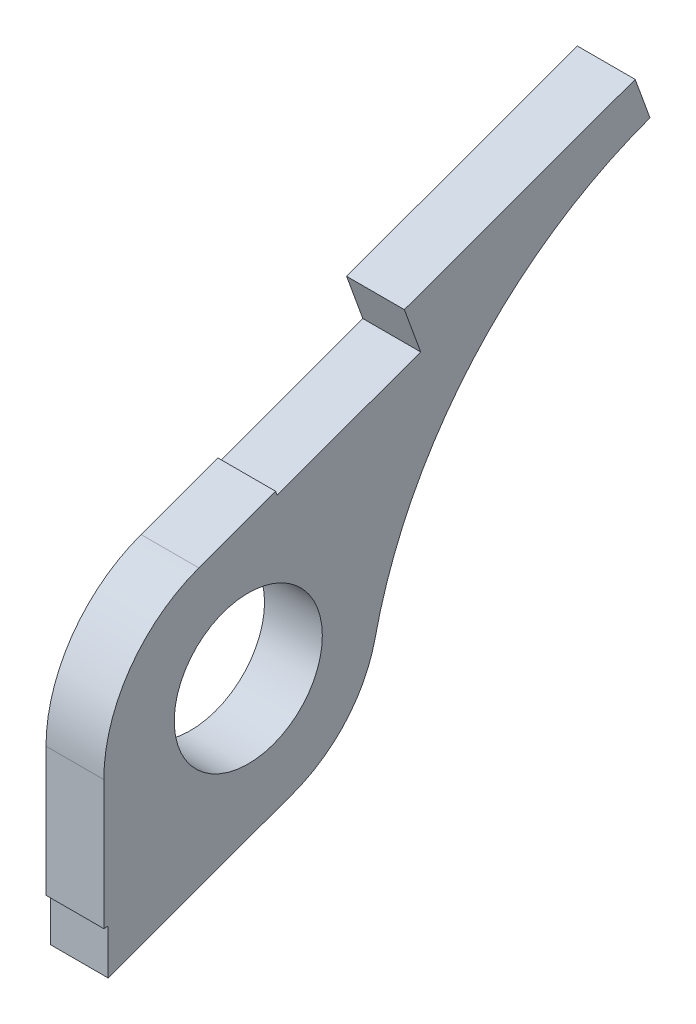
ISO-10303-21;
HEADER;
FILE_DESCRIPTION(('STEP AP214'),'2;1');
FILE_NAME('part.step','',(''),(''),'','','');
FILE_SCHEMA(('AUTOMOTIVE_DESIGN { 1 0 10303 214 1 1 1 1 }'));
ENDSEC;
DATA;
#1=APPLICATION_CONTEXT('core data for automotive mechanical design processes');
#2=APPLICATION_PROTOCOL_DEFINITION('international standard','automotive_design',2000,#1);
#3=PRODUCT_CONTEXT('',#1,'mechanical');
#4=PRODUCT('Part','Part','',(#3));
#5=PRODUCT_RELATED_PRODUCT_CATEGORY('part','',(#4));
#6=PRODUCT_DEFINITION_FORMATION('','',#4);
#7=PRODUCT_DEFINITION_CONTEXT('part definition',#1,'design');
#8=PRODUCT_DEFINITION('design','',#6,#7);
#9=PRODUCT_DEFINITION_SHAPE('','',#8);
#10=(LENGTH_UNIT() NAMED_UNIT(*) SI_UNIT(.MILLI.,.METRE.));
#11=(NAMED_UNIT(*) PLANE_ANGLE_UNIT() SI_UNIT($,.RADIAN.));
#12=(NAMED_UNIT(*) SI_UNIT($,.STERADIAN.) SOLID_ANGLE_UNIT());
#13=UNCERTAINTY_MEASURE_WITH_UNIT(LENGTH_MEASURE(1.E-05),#10,'distance_accuracy_value','');
#14=(GEOMETRIC_REPRESENTATION_CONTEXT(3) GLOBAL_UNCERTAINTY_ASSIGNED_CONTEXT((#13)) GLOBAL_UNIT_ASSIGNED_CONTEXT((#10,
#11,#12)) REPRESENTATION_CONTEXT('',''));
#15=CARTESIAN_POINT('',(0.,0.,0.));
#16=DIRECTION('',(0.,0.,1.));
#17=DIRECTION('',(1.,0.,0.));
#18=AXIS2_PLACEMENT_3D('',#15,#16,#17);
#19=CARTESIAN_POINT('',(241.308851424871,106.448198171886,262.091802222187));
#20=DIRECTION('',(0.,0.342020143325663,-0.93969262078591));
#21=DIRECTION('',(0.,0.939692620785911,0.342020143325663));
#22=AXIS2_PLACEMENT_3D('',#19,#20,#21);
#23=PLANE('',#22);
#24=DIRECTION('',(0.,0.93969262078591,0.342020143325663));
#25=VECTOR('',#24,1.);
#26=CARTESIAN_POINT('',(237.308851424871,106.448198171886,262.091802222187));
#27=LINE('',#26,#25);
#28=CARTESIAN_POINT('',(237.308851424871,106.730105958122,262.194408265185));
#29=VERTEX_POINT('',#28);
#30=CARTESIAN_POINT('',(237.308851424871,109.549183820479,263.220468695162));
#31=VERTEX_POINT('',#30);
#32=EDGE_CURVE('E234',#29,#31,#27,.T.);
#33=ORIENTED_EDGE('',*,*,#32,.T.);
#34=DIRECTION('',(-1.,0.,0.));
#35=VECTOR('',#34,1.);
#36=CARTESIAN_POINT('',(241.308851424871,109.549183820479,263.220468695162));
#37=LINE('',#36,#35);
#38=CARTESIAN_POINT('',(241.308851424871,109.549183820479,263.220468695162));
#39=VERTEX_POINT('',#38);
#40=EDGE_CURVE('E265',#39,#31,#37,.T.);
#41=ORIENTED_EDGE('',*,*,#40,.F.);
#42=DIRECTION('',(0.,0.93969262078591,0.342020143325663));
#43=VECTOR('',#42,1.);
#44=CARTESIAN_POINT('',(241.308851424871,106.448198171886,262.091802222187));
#45=LINE('',#44,#43);
#46=CARTESIAN_POINT('',(241.308851424871,106.730105958122,262.194408265185));
#47=VERTEX_POINT('',#46);
#48=EDGE_CURVE('E235',#47,#39,#45,.T.);
#49=ORIENTED_EDGE('',*,*,#48,.F.);
#50=DIRECTION('',(-1.,0.,0.));
#51=VECTOR('',#50,1.);
#52=CARTESIAN_POINT('',(241.308851424871,106.730105958122,262.194408265185));
#53=LINE('',#52,#51);
#54=EDGE_CURVE('E174',#47,#29,#53,.T.);
#55=ORIENTED_EDGE('',*,*,#54,.T.);
#56=EDGE_LOOP('',(#33,#41,#49,#55));
#57=FACE_BOUND('',#56,.T.);
#58=ADVANCED_FACE('F41',(#57),#23,.T.);
#59=CARTESIAN_POINT('',(241.308851424871,100.63385573535,278.066576775547));
#60=DIRECTION('',(0.,-0.342020143325663,0.93969262078591));
#61=DIRECTION('',(0.,-0.939692620785911,-0.342020143325663));
#62=AXIS2_PLACEMENT_3D('',#59,#60,#61);
#63=PLANE('',#62);
#64=DIRECTION('',(0.,0.93969262078591,0.342020143325663));
#65=VECTOR('',#64,1.);
#66=CARTESIAN_POINT('',(241.308851424871,100.63385573535,278.066576775547));
#67=LINE('',#66,#65);
#68=CARTESIAN_POINT('',(241.308851424871,100.63385573535,278.066576775547));
#69=VERTEX_POINT('',#68);
#70=CARTESIAN_POINT('',(241.308851424871,103.734841383943,279.195243248522));
#71=VERTEX_POINT('',#70);
#72=EDGE_CURVE('E244',#69,#71,#67,.T.);
#73=ORIENTED_EDGE('',*,*,#72,.T.);
#74=DIRECTION('',(1.,0.,0.));
#75=VECTOR('',#74,1.);
#76=CARTESIAN_POINT('',(237.308851424871,103.734841383943,279.195243248522));
#77=LINE('',#76,#75);
#78=CARTESIAN_POINT('',(237.308851424871,103.734841383943,279.195243248522));
#79=VERTEX_POINT('',#78);
#80=EDGE_CURVE('E57',#79,#71,#77,.T.);
#81=ORIENTED_EDGE('',*,*,#80,.F.);
#82=DIRECTION('',(0.,0.93969262078591,0.342020143325663));
#83=VECTOR('',#82,1.);
#84=CARTESIAN_POINT('',(237.308851424871,100.63385573535,278.066576775547));
#85=LINE('',#84,#83);
#86=CARTESIAN_POINT('',(237.308851424871,100.63385573535,278.066576775548));
#87=VERTEX_POINT('',#86);
#88=EDGE_CURVE('E241',#87,#79,#85,.T.);
#89=ORIENTED_EDGE('',*,*,#88,.F.);
#90=DIRECTION('',(1.,0.,0.));
#91=VECTOR('',#90,1.);
#92=CARTESIAN_POINT('',(241.308851424871,100.63385573535,278.066576775547));
#93=LINE('',#92,#91);
#94=EDGE_CURVE('E242',#87,#69,#93,.T.);
#95=ORIENTED_EDGE('',*,*,#94,.T.);
#96=EDGE_LOOP('',(#73,#81,#89,#95));
#97=FACE_BOUND('',#96,.T.);
#98=ADVANCED_FACE('F286',(#97),#63,.T.);
#99=CARTESIAN_POINT('',(237.308851424871,78.5393273345444,251.933803965415));
#100=DIRECTION('',(1.,0.,0.));
#101=DIRECTION('',(0.,0.,-1.));
#102=AXIS2_PLACEMENT_3D('',#99,#100,#101);
#103=PLANE('',#102);
#104=CARTESIAN_POINT('',(237.308851424871,87.0329435138107,289.997677706789));
#105=DIRECTION('',(1.,0.,0.));
#106=DIRECTION('',(0.,0.,-1.));
#107=AXIS2_PLACEMENT_3D('',#104,#105,#106);
#108=CIRCLE('',#107,5.125);
#109=CARTESIAN_POINT('',(237.308851424871,87.0329435138107,284.872677706789));
#110=VERTEX_POINT('',#109);
#111=EDGE_CURVE('E175',#110,#110,#108,.T.);
#112=ORIENTED_EDGE('',*,*,#111,.T.);
#113=EDGE_LOOP('',(#112));
#114=FACE_BOUND('',#113,.T.);
#115=DIRECTION('',(0.,-0.342020143325664,0.93969262078591));
#116=VECTOR('',#115,1.);
#117=CARTESIAN_POINT('',(237.308851424871,109.549183820479,263.220468695162));
#118=LINE('',#117,#116);
#119=EDGE_CURVE('E240',#31,#79,#118,.T.);
#120=ORIENTED_EDGE('',*,*,#119,.F.);
#121=ORIENTED_EDGE('',*,*,#32,.F.);
#122=CARTESIAN_POINT('',(237.308851424871,78.5393273345444,251.933803965415));
#123=DIRECTION('',(-1.,0.,0.));
#124=DIRECTION('',(0.,0.,-1.));
#125=AXIS2_PLACEMENT_3D('',#122,#123,#124);
#126=CIRCLE('',#125,30.0000000000002);
#127=CARTESIAN_POINT('',(237.308851424871,85.0728782416731,281.213706843395));
#128=VERTEX_POINT('',#127);
#129=EDGE_CURVE('E178',#128,#29,#126,.T.);
#130=ORIENTED_EDGE('',*,*,#129,.F.);
#131=CARTESIAN_POINT('',(237.308851424871,87.0329435138107,289.997677706789));
#132=DIRECTION('',(1.,0.,0.));
#133=DIRECTION('',(0.,0.,-1.));
#134=AXIS2_PLACEMENT_3D('',#131,#132,#133);
#135=CIRCLE('',#134,8.99999999999944);
#136=CARTESIAN_POINT('',(237.308851424871,78.5757099267382,286.919496416858));
#137=VERTEX_POINT('',#136);
#138=EDGE_CURVE('E206',#137,#128,#135,.T.);
#139=ORIENTED_EDGE('',*,*,#138,.F.);
#140=DIRECTION('',(0.,0.34202014332588,-0.939692620785831));
#141=VECTOR('',#140,1.);
#142=CARTESIAN_POINT('',(237.308851424871,73.8156412188629,299.997677706789));
#143=LINE('',#142,#141);
#144=CARTESIAN_POINT('',(237.308851424871,73.924832289143,299.697677706789));
#145=VERTEX_POINT('',#144);
#146=EDGE_CURVE('E200',#145,#137,#143,.T.);
#147=ORIENTED_EDGE('',*,*,#146,.F.);
#148=DIRECTION('',(0.,-1.,0.));
#149=VECTOR('',#148,1.);
#150=CARTESIAN_POINT('',(237.308851424871,78.5393273345444,299.697677706789));
#151=LINE('',#150,#149);
#152=CARTESIAN_POINT('',(237.308851424871,77.0329435138107,299.697677706789));
#153=VERTEX_POINT('',#152);
#154=EDGE_CURVE('E183',#153,#145,#151,.T.);
#155=ORIENTED_EDGE('',*,*,#154,.F.);
#156=DIRECTION('',(0.,0.,1.));
#157=VECTOR('',#156,1.);
#158=CARTESIAN_POINT('',(237.308851424871,77.0329435138107,251.933803965415));
#159=LINE('',#158,#157);
#160=CARTESIAN_POINT('',(237.308851424871,77.0329435138107,299.997677706789));
#161=VERTEX_POINT('',#160);
#162=EDGE_CURVE('E179',#153,#161,#159,.T.);
#163=ORIENTED_EDGE('',*,*,#162,.T.);
#164=DIRECTION('',(0.,-1.,0.));
#165=VECTOR('',#164,1.);
#166=CARTESIAN_POINT('',(237.308851424871,85.9687657413357,299.997677706789));
#167=LINE('',#166,#165);
#168=CARTESIAN_POINT('',(237.308851424871,85.9687657413357,299.997677706789));
#169=VERTEX_POINT('',#168);
#170=EDGE_CURVE('E142',#169,#161,#167,.T.);
#171=ORIENTED_EDGE('',*,*,#170,.F.);
#172=CARTESIAN_POINT('',(237.308851424871,85.9687657413348,289.997677706789));
#173=DIRECTION('',(1.,0.,0.));
#174=DIRECTION('',(0.,0.,-1.));
#175=AXIS2_PLACEMENT_3D('',#172,#173,#174);
#176=CIRCLE('',#175,10.0000000000002);
#177=CARTESIAN_POINT('',(237.308851424871,95.3656919491942,293.417879140046));
#178=VERTEX_POINT('',#177);
#179=EDGE_CURVE('E201',#178,#169,#176,.T.);
#180=ORIENTED_EDGE('',*,*,#179,.F.);
#181=DIRECTION('',(0.,-0.342020143325735,0.939692620785884));
#182=VECTOR('',#181,1.);
#183=CARTESIAN_POINT('',(237.308851424871,97.3005430514117,288.101919426697));
#184=LINE('',#183,#182);
#185=CARTESIAN_POINT('',(237.308851424871,97.3005430514117,288.101919426697));
#186=VERTEX_POINT('',#185);
#187=EDGE_CURVE('E210',#186,#178,#184,.T.);
#188=ORIENTED_EDGE('',*,*,#187,.F.);
#189=DIRECTION('',(0.,0.939692620785911,0.342020143325663));
#190=VECTOR('',#189,1.);
#191=CARTESIAN_POINT('',(237.308851424871,69.1097644278345,277.841315126928));
#192=LINE('',#191,#190);
#193=CARTESIAN_POINT('',(237.308851424871,97.0186352651759,287.9993133837));
#194=VERTEX_POINT('',#193);
#195=EDGE_CURVE('E260',#194,#186,#192,.T.);
#196=ORIENTED_EDGE('',*,*,#195,.F.);
#197=DIRECTION('',(0.,-0.342020143325663,0.939692620785911));
#198=VECTOR('',#197,1.);
#199=CARTESIAN_POINT('',(237.308851424871,106.448198171886,262.091802222187));
#200=LINE('',#199,#198);
#201=EDGE_CURVE('E250',#87,#194,#200,.T.);
#202=ORIENTED_EDGE('',*,*,#201,.F.);
#203=ORIENTED_EDGE('',*,*,#88,.T.);
#204=EDGE_LOOP('',(#120,#121,#130,#139,#147,#155,#163,#171,#180,#188,#196,#202,#203));
#205=FACE_BOUND('',#204,.T.);
#206=ADVANCED_FACE('F238',(#114,#205),#103,.F.);
#207=CARTESIAN_POINT('',(241.308851424871,78.5393273345444,251.933803965415));
#208=DIRECTION('',(1.,0.,0.));
#209=DIRECTION('',(0.,0.,-1.));
#210=AXIS2_PLACEMENT_3D('',#207,#208,#209);
#211=PLANE('',#210);
#212=DIRECTION('',(0.,1.,0.));
#213=VECTOR('',#212,1.);
#214=CARTESIAN_POINT('',(241.308851424871,78.5393273345444,299.697677706789));
#215=LINE('',#214,#213);
#216=CARTESIAN_POINT('',(241.308851424871,73.924832289143,299.697677706789));
#217=VERTEX_POINT('',#216);
#218=CARTESIAN_POINT('',(241.308851424871,77.0329435138107,299.697677706789));
#219=VERTEX_POINT('',#218);
#220=EDGE_CURVE('E153',#217,#219,#215,.T.);
#221=ORIENTED_EDGE('',*,*,#220,.F.);
#222=DIRECTION('',(0.,0.34202014332588,-0.939692620785831));
#223=VECTOR('',#222,1.);
#224=CARTESIAN_POINT('',(241.308851424871,73.8156412188629,299.997677706789));
#225=LINE('',#224,#223);
#226=CARTESIAN_POINT('',(241.308851424871,78.5757099267382,286.919496416858));
#227=VERTEX_POINT('',#226);
#228=EDGE_CURVE('E161',#217,#227,#225,.T.);
#229=ORIENTED_EDGE('',*,*,#228,.T.);
#230=CARTESIAN_POINT('',(241.308851424871,87.0329435138107,289.997677706789));
#231=DIRECTION('',(1.,0.,0.));
#232=DIRECTION('',(0.,0.,-1.));
#233=AXIS2_PLACEMENT_3D('',#230,#231,#232);
#234=CIRCLE('',#233,8.99999999999944);
#235=CARTESIAN_POINT('',(241.308851424871,85.0728782416731,281.213706843395));
#236=VERTEX_POINT('',#235);
#237=EDGE_CURVE('E165',#227,#236,#234,.T.);
#238=ORIENTED_EDGE('',*,*,#237,.T.);
#239=CARTESIAN_POINT('',(241.308851424871,78.5393273345444,251.933803965415));
#240=DIRECTION('',(-1.,0.,0.));
#241=DIRECTION('',(0.,0.,-1.));
#242=AXIS2_PLACEMENT_3D('',#239,#240,#241);
#243=CIRCLE('',#242,30.0000000000002);
#244=EDGE_CURVE('E172',#236,#47,#243,.T.);
#245=ORIENTED_EDGE('',*,*,#244,.T.);
#246=ORIENTED_EDGE('',*,*,#48,.T.);
#247=DIRECTION('',(0.,0.342020143325663,-0.93969262078591));
#248=VECTOR('',#247,1.);
#249=CARTESIAN_POINT('',(241.308851424871,103.734841383943,279.195243248522));
#250=LINE('',#249,#248);
#251=EDGE_CURVE('E267',#71,#39,#250,.T.);
#252=ORIENTED_EDGE('',*,*,#251,.F.);
#253=ORIENTED_EDGE('',*,*,#72,.F.);
#254=DIRECTION('',(0.,-0.342020143325663,0.939692620785911));
#255=VECTOR('',#254,1.);
#256=CARTESIAN_POINT('',(241.308851424871,106.448198171886,262.091802222187));
#257=LINE('',#256,#255);
#258=CARTESIAN_POINT('',(241.308851424871,97.0186352651759,287.9993133837));
#259=VERTEX_POINT('',#258);
#260=EDGE_CURVE('E192',#69,#259,#257,.T.);
#261=ORIENTED_EDGE('',*,*,#260,.T.);
#262=DIRECTION('',(0.,0.939692620785911,0.342020143325663));
#263=VECTOR('',#262,1.);
#264=CARTESIAN_POINT('',(241.308851424871,69.1097644278345,277.841315126928));
#265=LINE('',#264,#263);
#266=CARTESIAN_POINT('',(241.308851424871,97.3005430514117,288.101919426697));
#267=VERTEX_POINT('',#266);
#268=EDGE_CURVE('E247',#259,#267,#265,.T.);
#269=ORIENTED_EDGE('',*,*,#268,.T.);
#270=DIRECTION('',(0.,-0.342020143325675,0.939692620785906));
#271=VECTOR('',#270,1.);
#272=CARTESIAN_POINT('',(241.308851424871,106.730105958122,262.194408265185));
#273=LINE('',#272,#271);
#274=CARTESIAN_POINT('',(241.308851424871,95.3656919491942,293.417879140046));
#275=VERTEX_POINT('',#274);
#276=EDGE_CURVE('E167',#267,#275,#273,.T.);
#277=ORIENTED_EDGE('',*,*,#276,.T.);
#278=CARTESIAN_POINT('',(241.308851424871,85.9687657413348,289.997677706789));
#279=DIRECTION('',(1.,0.,0.));
#280=DIRECTION('',(0.,0.,-1.));
#281=AXIS2_PLACEMENT_3D('',#278,#279,#280);
#282=CIRCLE('',#281,10.0000000000002);
#283=CARTESIAN_POINT('',(241.308851424871,85.9687657413357,299.997677706789));
#284=VERTEX_POINT('',#283);
#285=EDGE_CURVE('E158',#275,#284,#282,.T.);
#286=ORIENTED_EDGE('',*,*,#285,.T.);
#287=DIRECTION('',(0.,-1.,0.));
#288=VECTOR('',#287,1.);
#289=CARTESIAN_POINT('',(241.308851424871,85.9687657413357,299.997677706789));
#290=LINE('',#289,#288);
#291=CARTESIAN_POINT('',(241.308851424871,77.0329435138107,299.997677706789));
#292=VERTEX_POINT('',#291);
#293=EDGE_CURVE('E140',#284,#292,#290,.T.);
#294=ORIENTED_EDGE('',*,*,#293,.T.);
#295=DIRECTION('',(0.,0.,1.));
#296=VECTOR('',#295,1.);
#297=CARTESIAN_POINT('',(241.308851424871,77.0329435138107,251.933803965415));
#298=LINE('',#297,#296);
#299=EDGE_CURVE('E147',#219,#292,#298,.T.);
#300=ORIENTED_EDGE('',*,*,#299,.F.);
#301=EDGE_LOOP('',(#221,#229,#238,#245,#246,#252,#253,#261,#269,#277,#286,#294,#300));
#302=FACE_BOUND('',#301,.T.);
#303=CARTESIAN_POINT('',(241.308851424871,87.0329435138107,289.997677706789));
#304=DIRECTION('',(1.,0.,0.));
#305=DIRECTION('',(0.,0.,-1.));
#306=AXIS2_PLACEMENT_3D('',#303,#304,#305);
#307=CIRCLE('',#306,5.125);
#308=CARTESIAN_POINT('',(241.308851424871,87.0329435138107,284.872677706789));
#309=VERTEX_POINT('',#308);
#310=EDGE_CURVE('E180',#309,#309,#307,.T.);
#311=ORIENTED_EDGE('',*,*,#310,.F.);
#312=EDGE_LOOP('',(#311));
#313=FACE_BOUND('',#312,.T.);
#314=ADVANCED_FACE('F155',(#302,#313),#211,.T.);
#315=CARTESIAN_POINT('',(241.308851424871,85.9687657413357,299.997677706789));
#316=DIRECTION('',(0.,0.,-1.));
#317=DIRECTION('',(0.,1.,0.));
#318=AXIS2_PLACEMENT_3D('',#315,#316,#317);
#319=PLANE('',#318);
#320=DIRECTION('',(-1.,0.,0.));
#321=VECTOR('',#320,1.);
#322=CARTESIAN_POINT('',(191.308851424871,77.0329435138107,299.997677706789));
#323=LINE('',#322,#321);
#324=EDGE_CURVE('E45',#292,#161,#323,.T.);
#325=ORIENTED_EDGE('',*,*,#324,.F.);
#326=ORIENTED_EDGE('',*,*,#293,.F.);
#327=DIRECTION('',(-1.,0.,0.));
#328=VECTOR('',#327,1.);
#329=CARTESIAN_POINT('',(241.308851424871,85.9687657413357,299.997677706789));
#330=LINE('',#329,#328);
#331=EDGE_CURVE('E202',#284,#169,#330,.T.);
#332=ORIENTED_EDGE('',*,*,#331,.T.);
#333=ORIENTED_EDGE('',*,*,#170,.T.);
#334=EDGE_LOOP('',(#325,#326,#332,#333));
#335=FACE_BOUND('',#334,.T.);
#336=ADVANCED_FACE('F137',(#335),#319,.F.);
#337=CARTESIAN_POINT('',(239.308851424871,77.0329435138107,299.697677706789));
#338=DIRECTION('',(0.,1.,0.));
#339=DIRECTION('',(0.,0.,1.));
#340=AXIS2_PLACEMENT_3D('',#337,#338,#339);
#341=PLANE('',#340);
#342=DIRECTION('',(-1.,0.,0.));
#343=VECTOR('',#342,1.);
#344=CARTESIAN_POINT('',(239.308851424871,77.0329435138107,299.697677706789));
#345=LINE('',#344,#343);
#346=EDGE_CURVE('E145',#219,#153,#345,.T.);
#347=ORIENTED_EDGE('',*,*,#346,.F.);
#348=ORIENTED_EDGE('',*,*,#299,.T.);
#349=ORIENTED_EDGE('',*,*,#324,.T.);
#350=ORIENTED_EDGE('',*,*,#162,.F.);
#351=EDGE_LOOP('',(#347,#348,#349,#350));
#352=FACE_BOUND('',#351,.T.);
#353=ADVANCED_FACE('F148',(#352),#341,.F.);
#354=CARTESIAN_POINT('',(0.,0.,299.697677706789));
#355=DIRECTION('',(0.,0.,1.));
#356=DIRECTION('',(1.,0.,0.));
#357=AXIS2_PLACEMENT_3D('',#354,#355,#356);
#358=PLANE('',#357);
#359=ORIENTED_EDGE('',*,*,#154,.T.);
#360=DIRECTION('',(1.,0.,0.));
#361=VECTOR('',#360,1.);
#362=CARTESIAN_POINT('',(241.308851424871,73.924832289143,299.697677706789));
#363=LINE('',#362,#361);
#364=EDGE_CURVE('E186',#145,#217,#363,.T.);
#365=ORIENTED_EDGE('',*,*,#364,.T.);
#366=ORIENTED_EDGE('',*,*,#220,.T.);
#367=ORIENTED_EDGE('',*,*,#346,.T.);
#368=EDGE_LOOP('',(#359,#365,#366,#367));
#369=FACE_BOUND('',#368,.T.);
#370=ADVANCED_FACE('F43',(#369),#358,.T.);
#371=CARTESIAN_POINT('',(241.308851424871,73.8156412188629,299.997677706789));
#372=DIRECTION('',(0.,0.939692620785831,0.34202014332588));
#373=DIRECTION('',(0.,-0.34202014332588,0.939692620785832));
#374=AXIS2_PLACEMENT_3D('',#371,#372,#373);
#375=PLANE('',#374);
#376=ORIENTED_EDGE('',*,*,#228,.F.);
#377=ORIENTED_EDGE('',*,*,#364,.F.);
#378=ORIENTED_EDGE('',*,*,#146,.T.);
#379=DIRECTION('',(-1.,0.,0.));
#380=VECTOR('',#379,1.);
#381=CARTESIAN_POINT('',(241.308851424871,78.5757099267382,286.919496416858));
#382=LINE('',#381,#380);
#383=EDGE_CURVE('E184',#227,#137,#382,.T.);
#384=ORIENTED_EDGE('',*,*,#383,.F.);
#385=EDGE_LOOP('',(#376,#377,#378,#384));
#386=FACE_BOUND('',#385,.T.);
#387=ADVANCED_FACE('F271',(#386),#375,.F.);
#388=CARTESIAN_POINT('',(241.308851424871,87.0329435138107,289.997677706789));
#389=DIRECTION('',(-1.,0.,0.));
#390=DIRECTION('',(0.,0.,1.));
#391=AXIS2_PLACEMENT_3D('',#388,#389,#390);
#392=CYLINDRICAL_SURFACE('',#391,8.99999999999944);
#393=ORIENTED_EDGE('',*,*,#138,.T.);
#394=DIRECTION('',(-1.,0.,0.));
#395=VECTOR('',#394,1.);
#396=CARTESIAN_POINT('',(241.308851424871,85.0728782416731,281.213706843395));
#397=LINE('',#396,#395);
#398=EDGE_CURVE('E207',#236,#128,#397,.T.);
#399=ORIENTED_EDGE('',*,*,#398,.F.);
#400=ORIENTED_EDGE('',*,*,#237,.F.);
#401=ORIENTED_EDGE('',*,*,#383,.T.);
#402=EDGE_LOOP('',(#393,#399,#400,#401));
#403=FACE_BOUND('',#402,.T.);
#404=ADVANCED_FACE('F224',(#403),#392,.T.);
#405=CARTESIAN_POINT('',(241.308851424871,78.5393273345444,251.933803965415));
#406=DIRECTION('',(-1.,0.,0.));
#407=DIRECTION('',(0.,0.,1.));
#408=AXIS2_PLACEMENT_3D('',#405,#406,#407);
#409=CYLINDRICAL_SURFACE('',#408,30.0000000000002);
#410=ORIENTED_EDGE('',*,*,#129,.T.);
#411=ORIENTED_EDGE('',*,*,#54,.F.);
#412=ORIENTED_EDGE('',*,*,#244,.F.);
#413=ORIENTED_EDGE('',*,*,#398,.T.);
#414=EDGE_LOOP('',(#410,#411,#412,#413));
#415=FACE_BOUND('',#414,.T.);
#416=ADVANCED_FACE('F229',(#415),#409,.F.);
#417=CARTESIAN_POINT('',(241.308851424871,87.0329435138107,289.997677706789));
#418=DIRECTION('',(-1.,0.,0.));
#419=DIRECTION('',(0.,0.,1.));
#420=AXIS2_PLACEMENT_3D('',#417,#418,#419);
#421=CYLINDRICAL_SURFACE('',#420,5.125);
#422=ORIENTED_EDGE('',*,*,#310,.T.);
#423=EDGE_LOOP('',(#422));
#424=FACE_BOUND('',#423,.T.);
#425=ORIENTED_EDGE('',*,*,#111,.F.);
#426=EDGE_LOOP('',(#425));
#427=FACE_BOUND('',#426,.T.);
#428=ADVANCED_FACE('F308',(#424,#427),#421,.F.);
#429=CARTESIAN_POINT('',(241.308851424871,85.9687657413348,289.997677706789));
#430=DIRECTION('',(-1.,0.,0.));
#431=DIRECTION('',(0.,0.,1.));
#432=AXIS2_PLACEMENT_3D('',#429,#430,#431);
#433=CYLINDRICAL_SURFACE('',#432,10.0000000000002);
#434=ORIENTED_EDGE('',*,*,#179,.T.);
#435=ORIENTED_EDGE('',*,*,#331,.F.);
#436=ORIENTED_EDGE('',*,*,#285,.F.);
#437=DIRECTION('',(-1.,0.,0.));
#438=VECTOR('',#437,1.);
#439=CARTESIAN_POINT('',(241.308851424871,95.3656919491942,293.417879140046));
#440=LINE('',#439,#438);
#441=EDGE_CURVE('E197',#275,#178,#440,.T.);
#442=ORIENTED_EDGE('',*,*,#441,.T.);
#443=EDGE_LOOP('',(#434,#435,#436,#442));
#444=FACE_BOUND('',#443,.T.);
#445=ADVANCED_FACE('F277',(#444),#433,.T.);
#446=CARTESIAN_POINT('',(241.308851424871,97.3005430514117,288.101919426697));
#447=DIRECTION('',(0.,-0.939692620785884,-0.342020143325735));
#448=DIRECTION('',(0.,0.342020143325735,-0.939692620785884));
#449=AXIS2_PLACEMENT_3D('',#446,#447,#448);
#450=PLANE('',#449);
#451=DIRECTION('',(1.,0.,0.));
#452=VECTOR('',#451,1.);
#453=CARTESIAN_POINT('',(253.5,97.3005430514117,288.101919426697));
#454=LINE('',#453,#452);
#455=EDGE_CURVE('E11',#186,#267,#454,.T.);
#456=ORIENTED_EDGE('',*,*,#455,.F.);
#457=ORIENTED_EDGE('',*,*,#187,.T.);
#458=ORIENTED_EDGE('',*,*,#441,.F.);
#459=ORIENTED_EDGE('',*,*,#276,.F.);
#460=EDGE_LOOP('',(#456,#457,#458,#459));
#461=FACE_BOUND('',#460,.T.);
#462=ADVANCED_FACE('F280',(#461),#450,.F.);
#463=CARTESIAN_POINT('',(0.,178.230805965161,64.8707082005925));
#464=DIRECTION('',(0.,0.939692620785911,0.342020143325663));
#465=DIRECTION('',(0.,-0.342020143325663,0.939692620785911));
#466=AXIS2_PLACEMENT_3D('',#463,#464,#465);
#467=PLANE('',#466);
#468=ORIENTED_EDGE('',*,*,#94,.F.);
#469=ORIENTED_EDGE('',*,*,#201,.T.);
#470=DIRECTION('',(-1.,0.,0.));
#471=VECTOR('',#470,1.);
#472=CARTESIAN_POINT('',(241.508851424871,97.0186352651759,287.9993133837));
#473=LINE('',#472,#471);
#474=EDGE_CURVE('E262',#259,#194,#473,.T.);
#475=ORIENTED_EDGE('',*,*,#474,.F.);
#476=ORIENTED_EDGE('',*,*,#260,.F.);
#477=EDGE_LOOP('',(#468,#469,#475,#476));
#478=FACE_BOUND('',#477,.T.);
#479=ADVANCED_FACE('F283',(#478),#467,.T.);
#480=CARTESIAN_POINT('',(241.508851424871,97.0186352651759,287.9993133837));
#481=DIRECTION('',(0.,0.342020143325663,-0.93969262078591));
#482=DIRECTION('',(0.,0.939692620785911,0.342020143325663));
#483=AXIS2_PLACEMENT_3D('',#480,#481,#482);
#484=PLANE('',#483);
#485=ORIENTED_EDGE('',*,*,#474,.T.);
#486=ORIENTED_EDGE('',*,*,#195,.T.);
#487=ORIENTED_EDGE('',*,*,#455,.T.);
#488=ORIENTED_EDGE('',*,*,#268,.F.);
#489=EDGE_LOOP('',(#485,#486,#487,#488));
#490=FACE_BOUND('',#489,.T.);
#491=ADVANCED_FACE('F282',(#490),#484,.T.);
#492=CARTESIAN_POINT('',(0.,181.331791613754,65.9993746735672));
#493=DIRECTION('',(0.,0.939692620785911,0.342020143325663));
#494=DIRECTION('',(0.,-0.342020143325663,0.939692620785911));
#495=AXIS2_PLACEMENT_3D('',#492,#493,#494);
#496=PLANE('',#495);
#497=ORIENTED_EDGE('',*,*,#80,.T.);
#498=ORIENTED_EDGE('',*,*,#251,.T.);
#499=ORIENTED_EDGE('',*,*,#40,.T.);
#500=ORIENTED_EDGE('',*,*,#119,.T.);
#501=EDGE_LOOP('',(#497,#498,#499,#500));
#502=FACE_BOUND('',#501,.T.);
#503=ADVANCED_FACE('F287',(#502),#496,.T.);
#504=CLOSED_SHELL('',(#58,#98,#206,#314,#336,#353,#370,#387,#404,#416,#428,#445,#462,#479,#491,#503));
#505=MANIFOLD_SOLID_BREP('B2',#504);
#506=ADVANCED_BREP_SHAPE_REPRESENTATION('',(#18,#505),#14);
#507=SHAPE_DEFINITION_REPRESENTATION(#9,#506);
ENDSEC;
END-ISO-10303-21;
